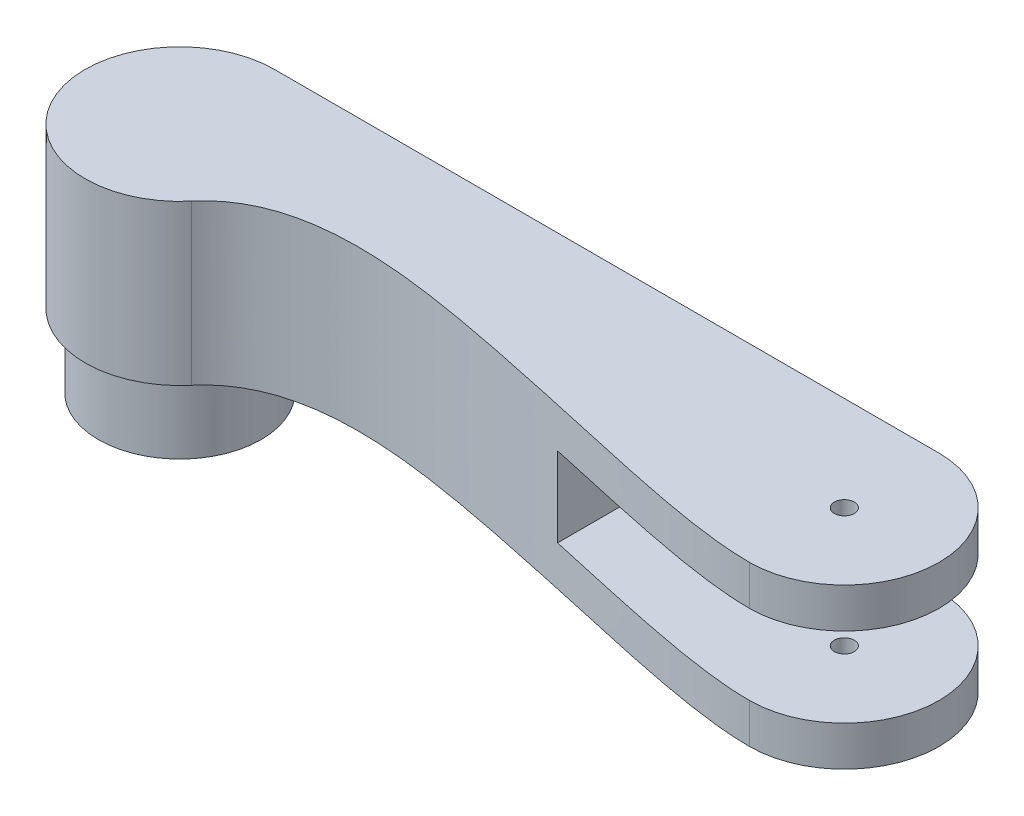
ISO-10303-21;
HEADER;
FILE_DESCRIPTION(('STEP AP214'),'2;1');
FILE_NAME('part.step','',(''),(''),'','','');
FILE_SCHEMA(('AUTOMOTIVE_DESIGN { 1 0 10303 214 1 1 1 1 }'));
ENDSEC;
DATA;
#1=APPLICATION_CONTEXT('core data for automotive mechanical design processes');
#2=APPLICATION_PROTOCOL_DEFINITION('international standard','automotive_design',2000,#1);
#3=PRODUCT_CONTEXT('',#1,'mechanical');
#4=PRODUCT('Part','Part','',(#3));
#5=PRODUCT_RELATED_PRODUCT_CATEGORY('part','',(#4));
#6=PRODUCT_DEFINITION_FORMATION('','',#4);
#7=PRODUCT_DEFINITION_CONTEXT('part definition',#1,'design');
#8=PRODUCT_DEFINITION('design','',#6,#7);
#9=PRODUCT_DEFINITION_SHAPE('','',#8);
#10=(LENGTH_UNIT() NAMED_UNIT(*) SI_UNIT(.MILLI.,.METRE.));
#11=(NAMED_UNIT(*) PLANE_ANGLE_UNIT() SI_UNIT($,.RADIAN.));
#12=(NAMED_UNIT(*) SI_UNIT($,.STERADIAN.) SOLID_ANGLE_UNIT());
#13=UNCERTAINTY_MEASURE_WITH_UNIT(LENGTH_MEASURE(1.E-05),#10,'distance_accuracy_value','');
#14=(GEOMETRIC_REPRESENTATION_CONTEXT(3) GLOBAL_UNCERTAINTY_ASSIGNED_CONTEXT((#13)) GLOBAL_UNIT_ASSIGNED_CONTEXT((#10,
#11,#12)) REPRESENTATION_CONTEXT('',''));
#15=CARTESIAN_POINT('',(0.,0.,0.));
#16=DIRECTION('',(0.,0.,1.));
#17=DIRECTION('',(1.,0.,0.));
#18=AXIS2_PLACEMENT_3D('',#15,#16,#17);
#19=CARTESIAN_POINT('',(-50.,6.,0.));
#20=DIRECTION('',(0.,1.,0.));
#21=DIRECTION('',(0.,0.,1.));
#22=AXIS2_PLACEMENT_3D('',#19,#20,#21);
#23=PLANE('',#22);
#24=CARTESIAN_POINT('',(50.,6.,0.));
#25=DIRECTION('',(0.,-1.,0.));
#26=DIRECTION('',(0.,0.,-1.));
#27=AXIS2_PLACEMENT_3D('',#24,#25,#26);
#28=CIRCLE('',#27,1.5);
#29=CARTESIAN_POINT('',(50.,6.,-1.50000000000002));
#30=VERTEX_POINT('',#29);
#31=EDGE_CURVE('E145',#30,#30,#28,.T.);
#32=ORIENTED_EDGE('',*,*,#31,.T.);
#33=EDGE_LOOP('',(#32));
#34=FACE_BOUND('',#33,.T.);
#35=DIRECTION('',(0.,0.,-1.));
#36=VECTOR('',#35,1.);
#37=CARTESIAN_POINT('',(15.,6.,-14.25));
#38=LINE('',#37,#36);
#39=CARTESIAN_POINT('',(15.,6.,8.15498555520889));
#40=VERTEX_POINT('',#39);
#41=CARTESIAN_POINT('',(15.,6.,-14.25));
#42=VERTEX_POINT('',#41);
#43=EDGE_CURVE('E87',#40,#42,#38,.T.);
#44=ORIENTED_EDGE('',*,*,#43,.F.);
#45=CARTESIAN_POINT('',(-39.0731568300049,6.,9.1469447543063));
#46=CARTESIAN_POINT('',(-31.5140940330976,6.,0.116968525897955));
#47=CARTESIAN_POINT('',(5.43865583696206,6.,4.64524054337758));
#48=CARTESIAN_POINT('',(38.6975143870054,6.,14.25));
#49=CARTESIAN_POINT('',(50.,6.,14.25));
#50=B_SPLINE_CURVE_WITH_KNOTS('',3,(#45,#46,#47,#48,#49),.UNSPECIFIED.,.F.,.F.,(4,1,4),(0.,
0.43590790251524,1.),.UNSPECIFIED.);
#51=CARTESIAN_POINT('',(50.,6.,14.25));
#52=VERTEX_POINT('',#51);
#53=EDGE_CURVE('E200',#52,#40,#50,.F.);
#54=ORIENTED_EDGE('',*,*,#53,.F.);
#55=CARTESIAN_POINT('',(50.,6.,0.));
#56=DIRECTION('',(0.,1.,0.));
#57=DIRECTION('',(0.,0.,1.));
#58=AXIS2_PLACEMENT_3D('',#55,#56,#57);
#59=CIRCLE('',#58,14.25);
#60=CARTESIAN_POINT('',(50.,6.,-14.25));
#61=VERTEX_POINT('',#60);
#62=EDGE_CURVE('E67',#52,#61,#59,.T.);
#63=ORIENTED_EDGE('',*,*,#62,.T.);
#64=DIRECTION('',(-1.,0.,0.));
#65=VECTOR('',#64,1.);
#66=CARTESIAN_POINT('',(-50.,6.,-14.25));
#67=LINE('',#66,#65);
#68=EDGE_CURVE('E152',#61,#42,#67,.T.);
#69=ORIENTED_EDGE('',*,*,#68,.T.);
#70=EDGE_LOOP('',(#44,#54,#63,#69));
#71=FACE_BOUND('',#70,.T.);
#72=ADVANCED_FACE('F43',(#34,#71),#23,.T.);
#73=CARTESIAN_POINT('',(-50.,0.,0.));
#74=DIRECTION('',(0.,1.,0.));
#75=DIRECTION('',(0.,0.,1.));
#76=AXIS2_PLACEMENT_3D('',#73,#74,#75);
#77=PLANE('',#76);
#78=CARTESIAN_POINT('',(-50.,0.,0.));
#79=DIRECTION('',(0.,1.,0.));
#80=DIRECTION('',(0.,0.,1.));
#81=AXIS2_PLACEMENT_3D('',#78,#79,#80);
#82=CIRCLE('',#81,12.25);
#83=CARTESIAN_POINT('',(-50.,0.,12.25));
#84=VERTEX_POINT('',#83);
#85=EDGE_CURVE('E11',#84,#84,#82,.F.);
#86=ORIENTED_EDGE('',*,*,#85,.F.);
#87=EDGE_LOOP('',(#86));
#88=FACE_BOUND('',#87,.T.);
#89=CARTESIAN_POINT('',(50.,0.,0.));
#90=DIRECTION('',(0.,-1.,0.));
#91=DIRECTION('',(0.,0.,-1.));
#92=AXIS2_PLACEMENT_3D('',#89,#90,#91);
#93=CIRCLE('',#92,1.5);
#94=CARTESIAN_POINT('',(50.,0.,-1.50000000000002));
#95=VERTEX_POINT('',#94);
#96=EDGE_CURVE('E190',#95,#95,#93,.T.);
#97=ORIENTED_EDGE('',*,*,#96,.F.);
#98=EDGE_LOOP('',(#97));
#99=FACE_BOUND('',#98,.T.);
#100=CARTESIAN_POINT('',(-39.0731568300049,0.,9.1469447543063));
#101=CARTESIAN_POINT('',(-31.5140940330976,0.,0.116968525897955));
#102=CARTESIAN_POINT('',(5.43865583696206,0.,4.64524054337758));
#103=CARTESIAN_POINT('',(38.6975143870054,0.,14.25));
#104=CARTESIAN_POINT('',(50.,0.,14.25));
#105=B_SPLINE_CURVE_WITH_KNOTS('',3,(#100,#101,#102,#103,#104),.UNSPECIFIED.,.F.,.F.,(4,1,4),
(0.,0.43590790251524,1.),.UNSPECIFIED.);
#106=CARTESIAN_POINT('',(50.,0.,14.25));
#107=VERTEX_POINT('',#106);
#108=CARTESIAN_POINT('',(-39.0731568300049,0.,9.1469447543063));
#109=VERTEX_POINT('',#108);
#110=EDGE_CURVE('E127',#107,#109,#105,.F.);
#111=ORIENTED_EDGE('',*,*,#110,.T.);
#112=CARTESIAN_POINT('',(-50.,0.,0.));
#113=DIRECTION('',(0.,1.,0.));
#114=DIRECTION('',(0.,0.,1.));
#115=AXIS2_PLACEMENT_3D('',#112,#113,#114);
#116=CIRCLE('',#115,14.25);
#117=CARTESIAN_POINT('',(-50.,0.,-14.25));
#118=VERTEX_POINT('',#117);
#119=EDGE_CURVE('E142',#118,#109,#116,.T.);
#120=ORIENTED_EDGE('',*,*,#119,.F.);
#121=DIRECTION('',(-1.,0.,0.));
#122=VECTOR('',#121,1.);
#123=CARTESIAN_POINT('',(-50.,0.,-14.25));
#124=LINE('',#123,#122);
#125=CARTESIAN_POINT('',(50.,0.,-14.25));
#126=VERTEX_POINT('',#125);
#127=EDGE_CURVE('E141',#126,#118,#124,.T.);
#128=ORIENTED_EDGE('',*,*,#127,.F.);
#129=CARTESIAN_POINT('',(50.,0.,0.));
#130=DIRECTION('',(0.,1.,0.));
#131=DIRECTION('',(0.,0.,1.));
#132=AXIS2_PLACEMENT_3D('',#129,#130,#131);
#133=CIRCLE('',#132,14.25);
#134=EDGE_CURVE('E79',#107,#126,#133,.T.);
#135=ORIENTED_EDGE('',*,*,#134,.F.);
#136=EDGE_LOOP('',(#111,#120,#128,#135));
#137=FACE_BOUND('',#136,.T.);
#138=ADVANCED_FACE('F140',(#88,#99,#137),#77,.F.);
#139=CARTESIAN_POINT('',(15.,18.,-14.25));
#140=DIRECTION('',(-1.,0.,0.));
#141=DIRECTION('',(0.,0.,1.));
#142=AXIS2_PLACEMENT_3D('',#139,#140,#141);
#143=PLANE('',#142);
#144=DIRECTION('',(0.,1.,0.));
#145=VECTOR('',#144,1.);
#146=CARTESIAN_POINT('',(15.,-0.000999999999997531,8.15498555520889));
#147=LINE('',#146,#145);
#148=CARTESIAN_POINT('',(15.0000000058143,18.,8.15498555648991));
#149=VERTEX_POINT('',#148);
#150=EDGE_CURVE('E199',#149,#40,#147,.F.);
#151=ORIENTED_EDGE('',*,*,#150,.T.);
#152=ORIENTED_EDGE('',*,*,#43,.T.);
#153=DIRECTION('',(0.,-1.,0.));
#154=VECTOR('',#153,1.);
#155=CARTESIAN_POINT('',(15.,18.,-14.25));
#156=LINE('',#155,#154);
#157=CARTESIAN_POINT('',(15.,18.,-14.25));
#158=VERTEX_POINT('',#157);
#159=EDGE_CURVE('E186',#158,#42,#156,.T.);
#160=ORIENTED_EDGE('',*,*,#159,.F.);
#161=DIRECTION('',(0.,0.,-1.));
#162=VECTOR('',#161,1.);
#163=CARTESIAN_POINT('',(15.,18.,-14.25));
#164=LINE('',#163,#162);
#165=EDGE_CURVE('E94',#149,#158,#164,.T.);
#166=ORIENTED_EDGE('',*,*,#165,.F.);
#167=EDGE_LOOP('',(#151,#152,#160,#166));
#168=FACE_BOUND('',#167,.T.);
#169=ADVANCED_FACE('F198',(#168),#143,.F.);
#170=CARTESIAN_POINT('',(-50.,18.,0.));
#171=DIRECTION('',(0.,1.,0.));
#172=DIRECTION('',(0.,0.,1.));
#173=AXIS2_PLACEMENT_3D('',#170,#171,#172);
#174=PLANE('',#173);
#175=CARTESIAN_POINT('',(50.,18.,0.));
#176=DIRECTION('',(0.,1.,0.));
#177=DIRECTION('',(0.,0.,1.));
#178=AXIS2_PLACEMENT_3D('',#175,#176,#177);
#179=CIRCLE('',#178,1.5);
#180=CARTESIAN_POINT('',(50.,18.,1.49999999999999));
#181=VERTEX_POINT('',#180);
#182=EDGE_CURVE('E162',#181,#181,#179,.F.);
#183=ORIENTED_EDGE('',*,*,#182,.F.);
#184=EDGE_LOOP('',(#183));
#185=FACE_BOUND('',#184,.T.);
#186=CARTESIAN_POINT('',(-39.0731568300049,18.,9.1469447543063));
#187=CARTESIAN_POINT('',(-31.5140940330976,18.,0.116968525897955));
#188=CARTESIAN_POINT('',(5.43865583696206,18.,4.64524054337758));
#189=CARTESIAN_POINT('',(38.6975143870054,18.,14.25));
#190=CARTESIAN_POINT('',(50.,18.,14.25));
#191=B_SPLINE_CURVE_WITH_KNOTS('',3,(#186,#187,#188,#189,#190),.UNSPECIFIED.,.F.,.F.,(4,1,4),
(0.,0.43590790251524,1.),.UNSPECIFIED.);
#192=CARTESIAN_POINT('',(50.,18.,14.25));
#193=VERTEX_POINT('',#192);
#194=EDGE_CURVE('E133',#193,#149,#191,.F.);
#195=ORIENTED_EDGE('',*,*,#194,.T.);
#196=ORIENTED_EDGE('',*,*,#165,.T.);
#197=DIRECTION('',(-1.,0.,0.));
#198=VECTOR('',#197,1.);
#199=CARTESIAN_POINT('',(-50.,18.,-14.25));
#200=LINE('',#199,#198);
#201=CARTESIAN_POINT('',(50.,18.,-14.25));
#202=VERTEX_POINT('',#201);
#203=EDGE_CURVE('E161',#202,#158,#200,.T.);
#204=ORIENTED_EDGE('',*,*,#203,.F.);
#205=CARTESIAN_POINT('',(50.,18.,0.));
#206=DIRECTION('',(0.,1.,0.));
#207=DIRECTION('',(0.,0.,1.));
#208=AXIS2_PLACEMENT_3D('',#205,#206,#207);
#209=CIRCLE('',#208,14.25);
#210=EDGE_CURVE('E160',#193,#202,#209,.T.);
#211=ORIENTED_EDGE('',*,*,#210,.F.);
#212=EDGE_LOOP('',(#195,#196,#204,#211));
#213=FACE_BOUND('',#212,.T.);
#214=ADVANCED_FACE('F238',(#185,#213),#174,.F.);
#215=CARTESIAN_POINT('',(-50.,24.,0.));
#216=DIRECTION('',(0.,1.,0.));
#217=DIRECTION('',(0.,0.,1.));
#218=AXIS2_PLACEMENT_3D('',#215,#216,#217);
#219=PLANE('',#218);
#220=CARTESIAN_POINT('',(50.,24.,0.));
#221=DIRECTION('',(0.,1.,0.));
#222=DIRECTION('',(0.,0.,1.));
#223=AXIS2_PLACEMENT_3D('',#220,#221,#222);
#224=CIRCLE('',#223,1.5);
#225=CARTESIAN_POINT('',(50.,24.,1.49999999999999));
#226=VERTEX_POINT('',#225);
#227=EDGE_CURVE('E171',#226,#226,#224,.T.);
#228=ORIENTED_EDGE('',*,*,#227,.F.);
#229=EDGE_LOOP('',(#228));
#230=FACE_BOUND('',#229,.T.);
#231=CARTESIAN_POINT('',(-50.,24.,0.));
#232=DIRECTION('',(0.,1.,0.));
#233=DIRECTION('',(0.,0.,1.));
#234=AXIS2_PLACEMENT_3D('',#231,#232,#233);
#235=CIRCLE('',#234,14.25);
#236=CARTESIAN_POINT('',(-50.,24.,-14.25));
#237=VERTEX_POINT('',#236);
#238=CARTESIAN_POINT('',(-39.0731568300049,24.,9.1469447543063));
#239=VERTEX_POINT('',#238);
#240=EDGE_CURVE('E58',#237,#239,#235,.T.);
#241=ORIENTED_EDGE('',*,*,#240,.T.);
#242=CARTESIAN_POINT('',(-39.0731568300049,24.,9.1469447543063));
#243=CARTESIAN_POINT('',(-31.5140940330976,24.,0.116968525897955));
#244=CARTESIAN_POINT('',(5.43865583696206,24.,4.64524054337758));
#245=CARTESIAN_POINT('',(38.6975143870054,24.,14.25));
#246=CARTESIAN_POINT('',(50.,24.,14.25));
#247=B_SPLINE_CURVE_WITH_KNOTS('',3,(#242,#243,#244,#245,#246),.UNSPECIFIED.,.F.,.F.,(4,1,4),
(0.,0.43590790251524,1.),.UNSPECIFIED.);
#248=CARTESIAN_POINT('',(50.,24.,14.25));
#249=VERTEX_POINT('',#248);
#250=EDGE_CURVE('E202',#239,#249,#247,.T.);
#251=ORIENTED_EDGE('',*,*,#250,.T.);
#252=CARTESIAN_POINT('',(50.,24.,0.));
#253=DIRECTION('',(0.,1.,0.));
#254=DIRECTION('',(0.,0.,1.));
#255=AXIS2_PLACEMENT_3D('',#252,#253,#254);
#256=CIRCLE('',#255,14.25);
#257=CARTESIAN_POINT('',(50.,24.,-14.25));
#258=VERTEX_POINT('',#257);
#259=EDGE_CURVE('E180',#249,#258,#256,.T.);
#260=ORIENTED_EDGE('',*,*,#259,.T.);
#261=DIRECTION('',(-1.,0.,0.));
#262=VECTOR('',#261,1.);
#263=CARTESIAN_POINT('',(-50.,24.,-14.25));
#264=LINE('',#263,#262);
#265=EDGE_CURVE('E182',#258,#237,#264,.T.);
#266=ORIENTED_EDGE('',*,*,#265,.T.);
#267=EDGE_LOOP('',(#241,#251,#260,#266));
#268=FACE_BOUND('',#267,.T.);
#269=ADVANCED_FACE('F235',(#230,#268),#219,.T.);
#270=CARTESIAN_POINT('',(-50.,6.,0.));
#271=DIRECTION('',(0.,-1.,0.));
#272=DIRECTION('',(0.,0.,-1.));
#273=AXIS2_PLACEMENT_3D('',#270,#271,#272);
#274=CYLINDRICAL_SURFACE('',#273,14.25);
#275=ORIENTED_EDGE('',*,*,#119,.T.);
#276=DIRECTION('',(0.,1.,0.));
#277=VECTOR('',#276,1.);
#278=CARTESIAN_POINT('',(-39.0731568300049,-0.001000000000001,9.1469447543063));
#279=LINE('',#278,#277);
#280=EDGE_CURVE('E130',#109,#239,#279,.T.);
#281=ORIENTED_EDGE('',*,*,#280,.T.);
#282=ORIENTED_EDGE('',*,*,#240,.F.);
#283=DIRECTION('',(0.,-1.,0.));
#284=VECTOR('',#283,1.);
#285=CARTESIAN_POINT('',(-50.,6.,-14.25));
#286=LINE('',#285,#284);
#287=EDGE_CURVE('E149',#237,#118,#286,.T.);
#288=ORIENTED_EDGE('',*,*,#287,.T.);
#289=EDGE_LOOP('',(#275,#281,#282,#288));
#290=FACE_BOUND('',#289,.T.);
#291=ADVANCED_FACE('F45',(#290),#274,.T.);
#292=CARTESIAN_POINT('',(50.,6.,0.));
#293=DIRECTION('',(0.,-1.,0.));
#294=DIRECTION('',(0.,0.,-1.));
#295=AXIS2_PLACEMENT_3D('',#292,#293,#294);
#296=CYLINDRICAL_SURFACE('',#295,14.25);
#297=ORIENTED_EDGE('',*,*,#134,.T.);
#298=DIRECTION('',(0.,-1.,0.));
#299=VECTOR('',#298,1.);
#300=CARTESIAN_POINT('',(50.,6.,-14.25));
#301=LINE('',#300,#299);
#302=EDGE_CURVE('E137',#61,#126,#301,.T.);
#303=ORIENTED_EDGE('',*,*,#302,.F.);
#304=ORIENTED_EDGE('',*,*,#62,.F.);
#305=DIRECTION('',(0.,-1.,0.));
#306=VECTOR('',#305,1.);
#307=CARTESIAN_POINT('',(50.,6.,14.25));
#308=LINE('',#307,#306);
#309=EDGE_CURVE('E51',#52,#107,#308,.T.);
#310=ORIENTED_EDGE('',*,*,#309,.T.);
#311=EDGE_LOOP('',(#297,#303,#304,#310));
#312=FACE_BOUND('',#311,.T.);
#313=ADVANCED_FACE('F136',(#312),#296,.T.);
#314=CARTESIAN_POINT('',(-50.,6.,-14.25));
#315=DIRECTION('',(0.,0.,1.));
#316=DIRECTION('',(1.,0.,0.));
#317=AXIS2_PLACEMENT_3D('',#314,#315,#316);
#318=PLANE('',#317);
#319=ORIENTED_EDGE('',*,*,#127,.T.);
#320=ORIENTED_EDGE('',*,*,#287,.F.);
#321=ORIENTED_EDGE('',*,*,#265,.F.);
#322=DIRECTION('',(0.,-1.,0.));
#323=VECTOR('',#322,1.);
#324=CARTESIAN_POINT('',(50.,24.,-14.25));
#325=LINE('',#324,#323);
#326=EDGE_CURVE('E157',#258,#202,#325,.T.);
#327=ORIENTED_EDGE('',*,*,#326,.T.);
#328=ORIENTED_EDGE('',*,*,#203,.T.);
#329=ORIENTED_EDGE('',*,*,#159,.T.);
#330=ORIENTED_EDGE('',*,*,#68,.F.);
#331=ORIENTED_EDGE('',*,*,#302,.T.);
#332=EDGE_LOOP('',(#319,#320,#321,#327,#328,#329,#330,#331));
#333=FACE_BOUND('',#332,.T.);
#334=ADVANCED_FACE('F197',(#333),#318,.F.);
#335=CARTESIAN_POINT('',(50.,6.,0.));
#336=DIRECTION('',(0.,-1.,0.));
#337=DIRECTION('',(0.,0.,-1.));
#338=AXIS2_PLACEMENT_3D('',#335,#336,#337);
#339=CYLINDRICAL_SURFACE('',#338,1.5);
#340=ORIENTED_EDGE('',*,*,#31,.F.);
#341=EDGE_LOOP('',(#340));
#342=FACE_BOUND('',#341,.T.);
#343=ORIENTED_EDGE('',*,*,#96,.T.);
#344=EDGE_LOOP('',(#343));
#345=FACE_BOUND('',#344,.T.);
#346=ADVANCED_FACE('F245',(#342,#345),#339,.F.);
#347=CARTESIAN_POINT('',(50.,24.,0.));
#348=DIRECTION('',(0.,-1.,0.));
#349=DIRECTION('',(0.,0.,-1.));
#350=AXIS2_PLACEMENT_3D('',#347,#348,#349);
#351=CYLINDRICAL_SURFACE('',#350,14.25);
#352=ORIENTED_EDGE('',*,*,#210,.T.);
#353=ORIENTED_EDGE('',*,*,#326,.F.);
#354=ORIENTED_EDGE('',*,*,#259,.F.);
#355=DIRECTION('',(0.,-1.,0.));
#356=VECTOR('',#355,1.);
#357=CARTESIAN_POINT('',(50.,24.,14.25));
#358=LINE('',#357,#356);
#359=EDGE_CURVE('E154',#249,#193,#358,.T.);
#360=ORIENTED_EDGE('',*,*,#359,.T.);
#361=EDGE_LOOP('',(#352,#353,#354,#360));
#362=FACE_BOUND('',#361,.T.);
#363=ADVANCED_FACE('F233',(#362),#351,.T.);
#364=CARTESIAN_POINT('',(50.,-0.001000000000001,0.));
#365=DIRECTION('',(0.,1.,0.));
#366=DIRECTION('',(0.,0.,1.));
#367=AXIS2_PLACEMENT_3D('',#364,#365,#366);
#368=CYLINDRICAL_SURFACE('',#367,1.5);
#369=CARTESIAN_POINT('',(50.,24.,1.49999999999999));
#370=CARTESIAN_POINT('',(50.,23.9375,1.49999999999999));
#371=CARTESIAN_POINT('',(50.,23.875,1.49999999999999));
#372=CARTESIAN_POINT('',(50.,23.75,1.49999999999999));
#373=CARTESIAN_POINT('',(50.,23.6875,1.49999999999999));
#374=CARTESIAN_POINT('',(50.,23.5625,1.49999999999999));
#375=CARTESIAN_POINT('',(50.,23.5,1.49999999999999));
#376=CARTESIAN_POINT('',(50.,23.375,1.49999999999999));
#377=CARTESIAN_POINT('',(50.,23.3125,1.49999999999999));
#378=CARTESIAN_POINT('',(50.,23.1875,1.49999999999999));
#379=CARTESIAN_POINT('',(50.,23.125,1.49999999999999));
#380=CARTESIAN_POINT('',(50.,23.,1.49999999999999));
#381=CARTESIAN_POINT('',(50.,22.9375,1.49999999999999));
#382=CARTESIAN_POINT('',(50.,22.8125,1.49999999999999));
#383=CARTESIAN_POINT('',(50.,22.75,1.49999999999999));
#384=CARTESIAN_POINT('',(50.,22.625,1.49999999999999));
#385=CARTESIAN_POINT('',(50.,22.5625,1.49999999999999));
#386=CARTESIAN_POINT('',(50.,22.4375,1.49999999999999));
#387=CARTESIAN_POINT('',(50.,22.375,1.49999999999999));
#388=CARTESIAN_POINT('',(50.,22.25,1.49999999999999));
#389=CARTESIAN_POINT('',(50.,22.1875,1.49999999999999));
#390=CARTESIAN_POINT('',(50.,22.0625,1.49999999999999));
#391=CARTESIAN_POINT('',(50.,22.,1.49999999999999));
#392=CARTESIAN_POINT('',(50.,21.875,1.49999999999999));
#393=CARTESIAN_POINT('',(50.,21.8125,1.49999999999999));
#394=CARTESIAN_POINT('',(50.,21.6875,1.49999999999999));
#395=CARTESIAN_POINT('',(50.,21.625,1.49999999999999));
#396=CARTESIAN_POINT('',(50.,21.5,1.49999999999999));
#397=CARTESIAN_POINT('',(50.,21.4375,1.49999999999999));
#398=CARTESIAN_POINT('',(50.,21.3125,1.49999999999999));
#399=CARTESIAN_POINT('',(50.,21.25,1.49999999999999));
#400=CARTESIAN_POINT('',(50.,21.125,1.49999999999999));
#401=CARTESIAN_POINT('',(50.,21.0625,1.49999999999999));
#402=CARTESIAN_POINT('',(50.,20.9375,1.49999999999999));
#403=CARTESIAN_POINT('',(50.,20.875,1.49999999999999));
#404=CARTESIAN_POINT('',(50.,20.75,1.49999999999999));
#405=CARTESIAN_POINT('',(50.,20.6875,1.49999999999999));
#406=CARTESIAN_POINT('',(50.,20.5625,1.49999999999999));
#407=CARTESIAN_POINT('',(50.,20.5,1.49999999999999));
#408=CARTESIAN_POINT('',(50.,20.375,1.49999999999999));
#409=CARTESIAN_POINT('',(50.,20.3125,1.49999999999999));
#410=CARTESIAN_POINT('',(50.,20.1875,1.49999999999999));
#411=CARTESIAN_POINT('',(50.,20.125,1.49999999999999));
#412=CARTESIAN_POINT('',(50.,20.,1.49999999999999));
#413=CARTESIAN_POINT('',(50.,19.9375,1.49999999999999));
#414=CARTESIAN_POINT('',(50.,19.8125,1.49999999999999));
#415=CARTESIAN_POINT('',(50.,19.75,1.49999999999999));
#416=CARTESIAN_POINT('',(50.,19.625,1.49999999999999));
#417=CARTESIAN_POINT('',(50.,19.5625,1.49999999999999));
#418=CARTESIAN_POINT('',(50.,19.4375,1.49999999999999));
#419=CARTESIAN_POINT('',(50.,19.375,1.49999999999999));
#420=CARTESIAN_POINT('',(50.,19.25,1.49999999999999));
#421=CARTESIAN_POINT('',(50.,19.1875,1.49999999999999));
#422=CARTESIAN_POINT('',(50.,19.0625,1.49999999999999));
#423=CARTESIAN_POINT('',(50.,19.,1.49999999999999));
#424=CARTESIAN_POINT('',(50.,18.875,1.49999999999999));
#425=CARTESIAN_POINT('',(50.,18.8125,1.49999999999999));
#426=CARTESIAN_POINT('',(50.,18.6875,1.49999999999999));
#427=CARTESIAN_POINT('',(50.,18.625,1.49999999999999));
#428=CARTESIAN_POINT('',(50.,18.5,1.49999999999999));
#429=CARTESIAN_POINT('',(50.,18.4375,1.49999999999999));
#430=CARTESIAN_POINT('',(50.,18.3125,1.49999999999999));
#431=CARTESIAN_POINT('',(50.,18.25,1.49999999999999));
#432=CARTESIAN_POINT('',(50.,18.125,1.49999999999999));
#433=CARTESIAN_POINT('',(50.,18.0625,1.49999999999999));
#434=CARTESIAN_POINT('',(50.,18.,1.49999999999999));
#435=B_SPLINE_CURVE_WITH_KNOTS('',3,(#369,#370,#371,#372,#373,#374,#375,#376,#377,#378,#379,
#380,#381,#382,#383,#384,#385,#386,#387,#388,#389,#390,#391,#392,#393,#394,#395,#396,#397,#398,
#399,#400,#401,#402,#403,#404,#405,#406,#407,#408,#409,#410,#411,#412,#413,#414,#415,#416,#417,
#418,#419,#420,#421,#422,#423,#424,#425,#426,#427,#428,#429,#430,#431,#432,#433,#434),
.UNSPECIFIED.,.F.,.F.,(4,2,2,2,2,2,2,2,2,2,2,2,2,2,2,2,2,2,2,2,2,2,2,2,2,2,2,2,2,2,2,2,4),(0.,
0.1875,0.375,0.5625,0.750000000000001,0.937500000000001,1.125,1.3125,1.5,1.6875,1.875,2.0625,
2.25,2.4375,2.625,2.8125,3.,3.1875,3.375,3.5625,3.75,3.9375,4.125,4.3125,4.5,4.6875,4.875,
5.0625,5.25,5.4375,5.625,5.8125,6.),.UNSPECIFIED.);
#436=EDGE_CURVE('BSEAM229',#226,#181,#435,.T.);
#437=ORIENTED_EDGE('',*,*,#227,.T.);
#438=ORIENTED_EDGE('',*,*,#182,.T.);
#439=ORIENTED_EDGE('',*,*,#436,.T.);
#440=ORIENTED_EDGE('',*,*,#436,.F.);
#441=EDGE_LOOP('',(#437,#439,#438,#440));
#442=FACE_BOUND('',#441,.T.);
#443=ADVANCED_FACE('F229',(#442),#368,.F.);
#444=CARTESIAN_POINT('',(-39.0731568300049,-0.000999999999997531,9.1469447543063));
#445=CARTESIAN_POINT('',(-31.5140940330976,-0.000999999999997531,0.116968525897955));
#446=CARTESIAN_POINT('',(5.43865583696206,-0.000999999999997531,4.64524054337758));
#447=CARTESIAN_POINT('',(38.6975143870054,-0.000999999999997531,14.25));
#448=CARTESIAN_POINT('',(50.,-0.000999999999997531,14.25));
#449=B_SPLINE_CURVE_WITH_KNOTS('',3,(#444,#445,#446,#447,#448),.UNSPECIFIED.,.F.,.F.,(4,1,4),
(0.,0.43590790251524,1.),.UNSPECIFIED.);
#450=DIRECTION('',(0.,1.,0.));
#451=VECTOR('',#450,1.);
#452=SURFACE_OF_LINEAR_EXTRUSION('',#449,#451);
#453=ORIENTED_EDGE('',*,*,#309,.F.);
#454=ORIENTED_EDGE('',*,*,#53,.T.);
#455=ORIENTED_EDGE('',*,*,#150,.F.);
#456=ORIENTED_EDGE('',*,*,#194,.F.);
#457=ORIENTED_EDGE('',*,*,#359,.F.);
#458=ORIENTED_EDGE('',*,*,#250,.F.);
#459=ORIENTED_EDGE('',*,*,#280,.F.);
#460=ORIENTED_EDGE('',*,*,#110,.F.);
#461=EDGE_LOOP('',(#453,#454,#455,#456,#457,#458,#459,#460));
#462=FACE_BOUND('',#461,.T.);
#463=ADVANCED_FACE('F128',(#462),#452,.T.);
#464=CARTESIAN_POINT('',(-50.,-11.,0.));
#465=DIRECTION('',(0.,1.,0.));
#466=DIRECTION('',(0.,0.,1.));
#467=AXIS2_PLACEMENT_3D('',#464,#465,#466);
#468=CYLINDRICAL_SURFACE('',#467,12.25);
#469=CARTESIAN_POINT('',(-50.,-11.,0.));
#470=DIRECTION('',(0.,-1.,0.));
#471=DIRECTION('',(0.,0.,-1.));
#472=AXIS2_PLACEMENT_3D('',#469,#470,#471);
#473=CIRCLE('',#472,12.25);
#474=CARTESIAN_POINT('',(-50.,-11.,-12.25));
#475=VERTEX_POINT('',#474);
#476=EDGE_CURVE('E134',#475,#475,#473,.T.);
#477=ORIENTED_EDGE('',*,*,#476,.F.);
#478=EDGE_LOOP('',(#477));
#479=FACE_BOUND('',#478,.T.);
#480=ORIENTED_EDGE('',*,*,#85,.T.);
#481=EDGE_LOOP('',(#480));
#482=FACE_BOUND('',#481,.T.);
#483=ADVANCED_FACE('F228',(#479,#482),#468,.T.);
#484=CARTESIAN_POINT('',(-50.,-11.,0.));
#485=DIRECTION('',(0.,-1.,0.));
#486=DIRECTION('',(0.,0.,-1.));
#487=AXIS2_PLACEMENT_3D('',#484,#485,#486);
#488=PLANE('',#487);
#489=CARTESIAN_POINT('',(-50.,-11.,7.5));
#490=DIRECTION('',(0.,-1.,0.));
#491=DIRECTION('',(0.,0.,-1.));
#492=AXIS2_PLACEMENT_3D('',#489,#490,#491);
#493=CIRCLE('',#492,2.49999999999999);
#494=CARTESIAN_POINT('',(-50.,-11.,5.));
#495=VERTEX_POINT('',#494);
#496=EDGE_CURVE('E420',#495,#495,#493,.T.);
#497=ORIENTED_EDGE('',*,*,#496,.F.);
#498=EDGE_LOOP('',(#497));
#499=FACE_BOUND('',#498,.T.);
#500=CARTESIAN_POINT('',(-50.,-11.,-7.5));
#501=DIRECTION('',(0.,-1.,0.));
#502=DIRECTION('',(0.,0.,-1.));
#503=AXIS2_PLACEMENT_3D('',#500,#501,#502);
#504=CIRCLE('',#503,2.49999999999999);
#505=CARTESIAN_POINT('',(-50.,-11.,-9.99999999999999));
#506=VERTEX_POINT('',#505);
#507=EDGE_CURVE('E425',#506,#506,#504,.T.);
#508=ORIENTED_EDGE('',*,*,#507,.F.);
#509=EDGE_LOOP('',(#508));
#510=FACE_BOUND('',#509,.T.);
#511=CARTESIAN_POINT('',(-50.,-11.,0.));
#512=DIRECTION('',(0.,-1.,0.));
#513=DIRECTION('',(0.,0.,-1.));
#514=AXIS2_PLACEMENT_3D('',#511,#512,#513);
#515=CIRCLE('',#514,3.);
#516=CARTESIAN_POINT('',(-50.,-11.,-3.));
#517=VERTEX_POINT('',#516);
#518=EDGE_CURVE('E433',#517,#517,#515,.T.);
#519=ORIENTED_EDGE('',*,*,#518,.F.);
#520=EDGE_LOOP('',(#519));
#521=FACE_BOUND('',#520,.T.);
#522=ORIENTED_EDGE('',*,*,#476,.T.);
#523=EDGE_LOOP('',(#522));
#524=FACE_BOUND('',#523,.T.);
#525=ADVANCED_FACE('F343',(#499,#510,#521,#524),#488,.T.);
#526=CARTESIAN_POINT('',(-50.,-5.,0.));
#527=DIRECTION('',(0.,-1.,0.));
#528=DIRECTION('',(0.,0.,-1.));
#529=AXIS2_PLACEMENT_3D('',#526,#527,#528);
#530=CYLINDRICAL_SURFACE('',#529,3.);
#531=CARTESIAN_POINT('',(-50.,-5.,0.));
#532=DIRECTION('',(0.,-1.,0.));
#533=DIRECTION('',(0.,0.,-1.));
#534=AXIS2_PLACEMENT_3D('',#531,#532,#533);
#535=CIRCLE('',#534,3.);
#536=CARTESIAN_POINT('',(-50.,-5.,-3.));
#537=VERTEX_POINT('',#536);
#538=EDGE_CURVE('E436',#537,#537,#535,.T.);
#539=ORIENTED_EDGE('',*,*,#538,.F.);
#540=EDGE_LOOP('',(#539));
#541=FACE_BOUND('',#540,.T.);
#542=ORIENTED_EDGE('',*,*,#518,.T.);
#543=EDGE_LOOP('',(#542));
#544=FACE_BOUND('',#543,.T.);
#545=ADVANCED_FACE('F351',(#541,#544),#530,.F.);
#546=CARTESIAN_POINT('',(-50.,-5.,0.));
#547=DIRECTION('',(0.,-1.,0.));
#548=DIRECTION('',(0.,0.,-1.));
#549=AXIS2_PLACEMENT_3D('',#546,#547,#548);
#550=PLANE('',#549);
#551=ORIENTED_EDGE('',*,*,#538,.T.);
#552=EDGE_LOOP('',(#551));
#553=FACE_BOUND('',#552,.T.);
#554=ADVANCED_FACE('F359',(#553),#550,.T.);
#555=CARTESIAN_POINT('',(-50.,-5.,-7.5));
#556=DIRECTION('',(0.,-1.,0.));
#557=DIRECTION('',(0.,0.,-1.));
#558=AXIS2_PLACEMENT_3D('',#555,#556,#557);
#559=CYLINDRICAL_SURFACE('',#558,2.49999999999999);
#560=CARTESIAN_POINT('',(-50.,-5.,-7.5));
#561=DIRECTION('',(0.,-1.,0.));
#562=DIRECTION('',(0.,0.,-1.));
#563=AXIS2_PLACEMENT_3D('',#560,#561,#562);
#564=CIRCLE('',#563,2.49999999999999);
#565=CARTESIAN_POINT('',(-50.,-5.,-9.99999999999999));
#566=VERTEX_POINT('',#565);
#567=EDGE_CURVE('E430',#566,#566,#564,.T.);
#568=ORIENTED_EDGE('',*,*,#567,.F.);
#569=EDGE_LOOP('',(#568));
#570=FACE_BOUND('',#569,.T.);
#571=ORIENTED_EDGE('',*,*,#507,.T.);
#572=EDGE_LOOP('',(#571));
#573=FACE_BOUND('',#572,.T.);
#574=ADVANCED_FACE('F368',(#570,#573),#559,.F.);
#575=CARTESIAN_POINT('',(-50.,-5.,-7.5));
#576=DIRECTION('',(0.,-1.,0.));
#577=DIRECTION('',(0.,0.,-1.));
#578=AXIS2_PLACEMENT_3D('',#575,#576,#577);
#579=PLANE('',#578);
#580=ORIENTED_EDGE('',*,*,#567,.T.);
#581=EDGE_LOOP('',(#580));
#582=FACE_BOUND('',#581,.T.);
#583=ADVANCED_FACE('F377',(#582),#579,.T.);
#584=CARTESIAN_POINT('',(-50.,-5.,7.5));
#585=DIRECTION('',(0.,-1.,0.));
#586=DIRECTION('',(0.,0.,-1.));
#587=AXIS2_PLACEMENT_3D('',#584,#585,#586);
#588=CYLINDRICAL_SURFACE('',#587,2.49999999999999);
#589=CARTESIAN_POINT('',(-50.,-5.,7.5));
#590=DIRECTION('',(0.,-1.,0.));
#591=DIRECTION('',(0.,0.,-1.));
#592=AXIS2_PLACEMENT_3D('',#589,#590,#591);
#593=CIRCLE('',#592,2.49999999999999);
#594=CARTESIAN_POINT('',(-50.,-5.,5.));
#595=VERTEX_POINT('',#594);
#596=EDGE_CURVE('E419',#595,#595,#593,.T.);
#597=ORIENTED_EDGE('',*,*,#596,.F.);
#598=EDGE_LOOP('',(#597));
#599=FACE_BOUND('',#598,.T.);
#600=ORIENTED_EDGE('',*,*,#496,.T.);
#601=EDGE_LOOP('',(#600));
#602=FACE_BOUND('',#601,.T.);
#603=ADVANCED_FACE('F386',(#599,#602),#588,.F.);
#604=CARTESIAN_POINT('',(-50.,-5.,7.5));
#605=DIRECTION('',(0.,-1.,0.));
#606=DIRECTION('',(0.,0.,-1.));
#607=AXIS2_PLACEMENT_3D('',#604,#605,#606);
#608=PLANE('',#607);
#609=ORIENTED_EDGE('',*,*,#596,.T.);
#610=EDGE_LOOP('',(#609));
#611=FACE_BOUND('',#610,.T.);
#612=ADVANCED_FACE('F395',(#611),#608,.T.);
#613=CLOSED_SHELL('',(#72,#138,#169,#214,#269,#291,#313,#334,#346,#363,#443,#463,#483,#525,#545,
#554,#574,#583,#603,#612));
#614=MANIFOLD_SOLID_BREP('B2',#613);
#615=ADVANCED_BREP_SHAPE_REPRESENTATION('',(#18,#614),#14);
#616=SHAPE_DEFINITION_REPRESENTATION(#9,#615);
ENDSEC;
END-ISO-10303-21;
